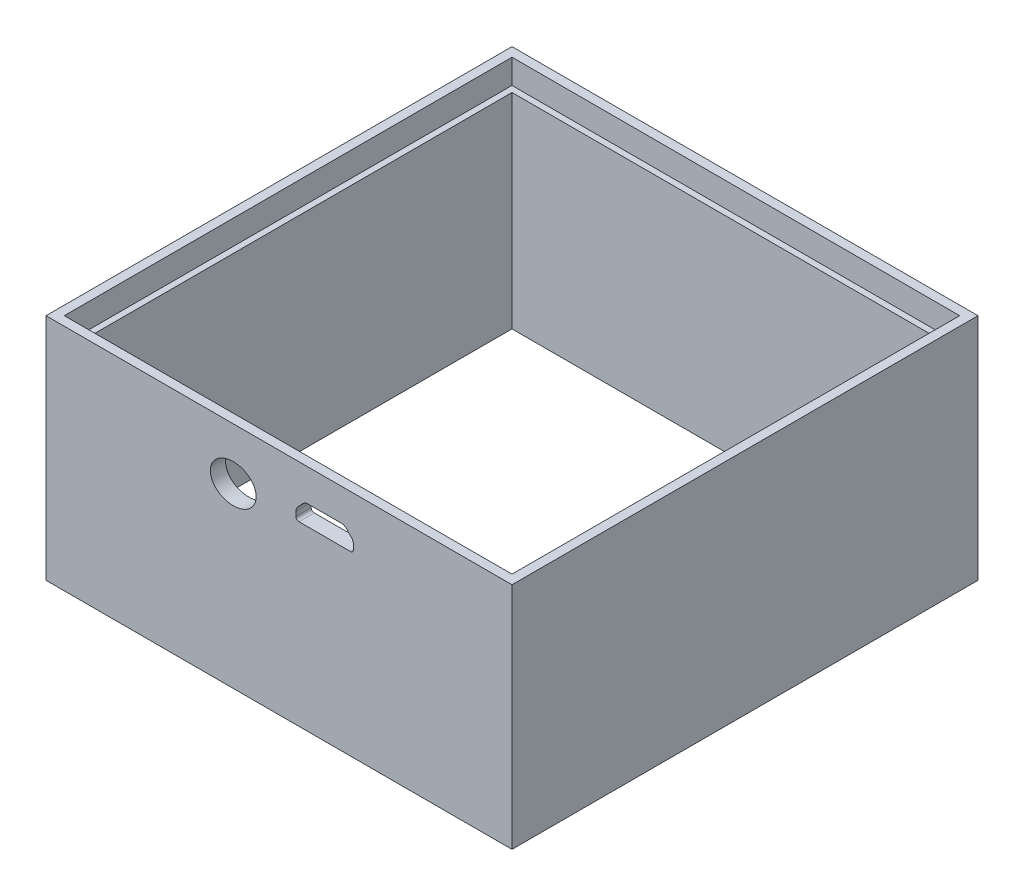
ISO-10303-21;
HEADER;
FILE_DESCRIPTION(('STEP AP214'),'2;1');
FILE_NAME('part.step','',(''),(''),'','','');
FILE_SCHEMA(('AUTOMOTIVE_DESIGN { 1 0 10303 214 1 1 1 1 }'));
ENDSEC;
DATA;
#1=APPLICATION_CONTEXT('core data for automotive mechanical design processes');
#2=APPLICATION_PROTOCOL_DEFINITION('international standard','automotive_design',2000,#1);
#3=PRODUCT_CONTEXT('',#1,'mechanical');
#4=PRODUCT('Part','Part','',(#3));
#5=PRODUCT_RELATED_PRODUCT_CATEGORY('part','',(#4));
#6=PRODUCT_DEFINITION_FORMATION('','',#4);
#7=PRODUCT_DEFINITION_CONTEXT('part definition',#1,'design');
#8=PRODUCT_DEFINITION('design','',#6,#7);
#9=PRODUCT_DEFINITION_SHAPE('','',#8);
#10=(LENGTH_UNIT() NAMED_UNIT(*) SI_UNIT(.MILLI.,.METRE.));
#11=(NAMED_UNIT(*) PLANE_ANGLE_UNIT() SI_UNIT($,.RADIAN.));
#12=(NAMED_UNIT(*) SI_UNIT($,.STERADIAN.) SOLID_ANGLE_UNIT());
#13=UNCERTAINTY_MEASURE_WITH_UNIT(LENGTH_MEASURE(1.E-05),#10,'distance_accuracy_value','');
#14=(GEOMETRIC_REPRESENTATION_CONTEXT(3) GLOBAL_UNCERTAINTY_ASSIGNED_CONTEXT((#13)) GLOBAL_UNIT_ASSIGNED_CONTEXT((#10,
#11,#12)) REPRESENTATION_CONTEXT('',''));
#15=CARTESIAN_POINT('',(0.,0.,0.));
#16=DIRECTION('',(0.,0.,1.));
#17=DIRECTION('',(1.,0.,0.));
#18=AXIS2_PLACEMENT_3D('',#15,#16,#17);
#19=CARTESIAN_POINT('',(-28.5,30.,0.));
#20=DIRECTION('',(0.,0.,-1.));
#21=DIRECTION('',(-1.,0.,0.));
#22=AXIS2_PLACEMENT_3D('',#19,#20,#21);
#23=PLANE('',#22);
#24=CARTESIAN_POINT('',(-5.99255578575196,23.2153393240226,0.));
#25=DIRECTION('',(0.,0.,-1.));
#26=DIRECTION('',(1.,0.,0.));
#27=AXIS2_PLACEMENT_3D('',#24,#25,#26);
#28=ELLIPSE('',#27,3.,2.5);
#29=CARTESIAN_POINT('',(-2.99255578575196,23.2153393240226,0.));
#30=VERTEX_POINT('',#29);
#31=EDGE_CURVE('E338',#30,#30,#28,.T.);
#32=ORIENTED_EDGE('',*,*,#31,.F.);
#33=EDGE_LOOP('',(#32));
#34=FACE_BOUND('',#33,.T.);
#35=DIRECTION('',(0.,-1.,0.));
#36=VECTOR('',#35,1.);
#37=CARTESIAN_POINT('',(-28.5,30.,0.));
#38=LINE('',#37,#36);
#39=CARTESIAN_POINT('',(-28.5,26.8,0.));
#40=VERTEX_POINT('',#39);
#41=CARTESIAN_POINT('',(-28.5,0.,0.));
#42=VERTEX_POINT('',#41);
#43=EDGE_CURVE('E469',#40,#42,#38,.T.);
#44=ORIENTED_EDGE('',*,*,#43,.F.);
#45=DIRECTION('',(1.,0.,0.));
#46=VECTOR('',#45,1.);
#47=CARTESIAN_POINT('',(-28.5,26.8,0.));
#48=LINE('',#47,#46);
#49=CARTESIAN_POINT('',(28.5,26.8,0.));
#50=VERTEX_POINT('',#49);
#51=EDGE_CURVE('E490',#40,#50,#48,.T.);
#52=ORIENTED_EDGE('',*,*,#51,.T.);
#53=DIRECTION('',(0.,-1.,0.));
#54=VECTOR('',#53,1.);
#55=CARTESIAN_POINT('',(28.5,30.,0.));
#56=LINE('',#55,#54);
#57=CARTESIAN_POINT('',(28.5,0.,0.));
#58=VERTEX_POINT('',#57);
#59=EDGE_CURVE('E453',#50,#58,#56,.T.);
#60=ORIENTED_EDGE('',*,*,#59,.T.);
#61=DIRECTION('',(1.,0.,0.));
#62=VECTOR('',#61,1.);
#63=CARTESIAN_POINT('',(-28.5,0.,0.));
#64=LINE('',#63,#62);
#65=EDGE_CURVE('E486',#42,#58,#64,.T.);
#66=ORIENTED_EDGE('',*,*,#65,.F.);
#67=EDGE_LOOP('',(#44,#52,#60,#66));
#68=FACE_BOUND('',#67,.T.);
#69=CARTESIAN_POINT('',(2.60777454000149,23.6,0.));
#70=DIRECTION('',(0.,0.,-1.));
#71=DIRECTION('',(-1.,0.,0.));
#72=AXIS2_PLACEMENT_3D('',#69,#70,#71);
#73=CIRCLE('',#72,0.399999999999942);
#74=CARTESIAN_POINT('',(2.20777454000155,23.6,0.));
#75=VERTEX_POINT('',#74);
#76=CARTESIAN_POINT('',(2.60777454000149,23.2,0.));
#77=VERTEX_POINT('',#76);
#78=EDGE_CURVE('E262',#75,#77,#73,.F.);
#79=ORIENTED_EDGE('',*,*,#78,.T.);
#80=DIRECTION('',(1.,0.,0.));
#81=VECTOR('',#80,1.);
#82=CARTESIAN_POINT('',(0.,23.2000000000001,0.));
#83=LINE('',#82,#81);
#84=CARTESIAN_POINT('',(9.35777454000155,23.2,0.));
#85=VERTEX_POINT('',#84);
#86=EDGE_CURVE('E55',#77,#85,#83,.T.);
#87=ORIENTED_EDGE('',*,*,#86,.T.);
#88=CARTESIAN_POINT('',(9.35777454000155,23.6,0.));
#89=DIRECTION('',(0.,0.,-1.));
#90=DIRECTION('',(-1.,0.,0.));
#91=AXIS2_PLACEMENT_3D('',#88,#89,#90);
#92=CIRCLE('',#91,0.39999999999994);
#93=CARTESIAN_POINT('',(9.75777454000149,23.6,0.));
#94=VERTEX_POINT('',#93);
#95=EDGE_CURVE('E223',#85,#94,#92,.F.);
#96=ORIENTED_EDGE('',*,*,#95,.T.);
#97=DIRECTION('',(0.,1.,0.));
#98=VECTOR('',#97,1.);
#99=CARTESIAN_POINT('',(9.75777454000142,0.,0.));
#100=LINE('',#99,#98);
#101=CARTESIAN_POINT('',(9.75777454000149,24.147689712403,0.));
#102=VERTEX_POINT('',#101);
#103=EDGE_CURVE('E227',#94,#102,#100,.T.);
#104=ORIENTED_EDGE('',*,*,#103,.T.);
#105=CARTESIAN_POINT('',(8.75777454000148,24.147689712403,0.));
#106=DIRECTION('',(0.,0.,-1.));
#107=DIRECTION('',(-1.,0.,0.));
#108=AXIS2_PLACEMENT_3D('',#105,#106,#107);
#109=CIRCLE('',#108,1.00000000000001);
#110=CARTESIAN_POINT('',(9.47916186103244,24.8402215405928,0.));
#111=VERTEX_POINT('',#110);
#112=EDGE_CURVE('E294',#102,#111,#109,.F.);
#113=ORIENTED_EDGE('',*,*,#112,.T.);
#114=DIRECTION('',(-0.692531828189709,0.721387321030956,0.));
#115=VECTOR('',#114,1.);
#116=CARTESIAN_POINT('',(17.3427219712748,16.6490130924236,0.));
#117=LINE('',#116,#115);
#118=CARTESIAN_POINT('',(8.85294398493937,25.4925318281897,0.));
#119=VERTEX_POINT('',#118);
#120=EDGE_CURVE('E290',#111,#119,#117,.T.);
#121=ORIENTED_EDGE('',*,*,#120,.T.);
#122=CARTESIAN_POINT('',(8.13155666390841,24.8,0.));
#123=DIRECTION('',(0.,0.,-1.));
#124=DIRECTION('',(-1.,0.,0.));
#125=AXIS2_PLACEMENT_3D('',#122,#123,#124);
#126=CIRCLE('',#125,1.00000000000001);
#127=CARTESIAN_POINT('',(8.13155666390841,25.8,0.));
#128=VERTEX_POINT('',#127);
#129=EDGE_CURVE('E286',#119,#128,#126,.F.);
#130=ORIENTED_EDGE('',*,*,#129,.T.);
#131=DIRECTION('',(-1.,0.,0.));
#132=VECTOR('',#131,1.);
#133=CARTESIAN_POINT('',(0.,25.8,0.));
#134=LINE('',#133,#132);
#135=CARTESIAN_POINT('',(3.83399241609457,25.8,0.));
#136=VERTEX_POINT('',#135);
#137=EDGE_CURVE('E282',#128,#136,#134,.T.);
#138=ORIENTED_EDGE('',*,*,#137,.T.);
#139=CARTESIAN_POINT('',(3.83399241609457,24.8,0.));
#140=DIRECTION('',(0.,0.,-1.));
#141=DIRECTION('',(-1.,0.,0.));
#142=AXIS2_PLACEMENT_3D('',#139,#140,#141);
#143=CIRCLE('',#142,1.00000000000002);
#144=CARTESIAN_POINT('',(3.11260509506368,25.4925318281898,0.));
#145=VERTEX_POINT('',#144);
#146=EDGE_CURVE('E278',#145,#136,#143,.T.);
#147=ORIENTED_EDGE('',*,*,#146,.F.);
#148=DIRECTION('',(0.692531828189797,0.721387321030872,0.));
#149=VECTOR('',#148,1.);
#150=CARTESIAN_POINT('',(-11.115854215237,10.67122004663,0.));
#151=LINE('',#150,#149);
#152=CARTESIAN_POINT('',(2.48638721897064,24.840221540593,0.));
#153=VERTEX_POINT('',#152);
#154=EDGE_CURVE('E274',#153,#145,#151,.T.);
#155=ORIENTED_EDGE('',*,*,#154,.F.);
#156=CARTESIAN_POINT('',(3.20777454000152,24.1476897124032,0.));
#157=DIRECTION('',(0.,0.,-1.));
#158=DIRECTION('',(-1.,0.,0.));
#159=AXIS2_PLACEMENT_3D('',#156,#157,#158);
#160=CIRCLE('',#159,1.00000000000001);
#161=CARTESIAN_POINT('',(2.20777454000151,24.1476897124032,0.));
#162=VERTEX_POINT('',#161);
#163=EDGE_CURVE('E270',#153,#162,#160,.F.);
#164=ORIENTED_EDGE('',*,*,#163,.T.);
#165=DIRECTION('',(0.,1.,0.));
#166=VECTOR('',#165,1.);
#167=CARTESIAN_POINT('',(2.2077745400033,1.64330529824927E-13,0.));
#168=LINE('',#167,#166);
#169=EDGE_CURVE('E266',#75,#162,#168,.T.);
#170=ORIENTED_EDGE('',*,*,#169,.F.);
#171=EDGE_LOOP('',(#79,#87,#96,#104,#113,#121,#130,#138,#147,#155,#164,#170));
#172=FACE_BOUND('',#171,.T.);
#173=ADVANCED_FACE('F39',(#34,#68,#172),#23,.T.);
#174=CARTESIAN_POINT('',(30.5,30.,2.));
#175=DIRECTION('',(0.,0.,-1.));
#176=DIRECTION('',(-1.,0.,0.));
#177=AXIS2_PLACEMENT_3D('',#174,#175,#176);
#178=PLANE('',#177);
#179=DIRECTION('',(1.,0.,0.));
#180=VECTOR('',#179,1.);
#181=CARTESIAN_POINT('',(30.5,0.,2.));
#182=LINE('',#181,#180);
#183=CARTESIAN_POINT('',(-30.5,0.,2.00000000000001));
#184=VERTEX_POINT('',#183);
#185=CARTESIAN_POINT('',(30.5,0.,2.));
#186=VERTEX_POINT('',#185);
#187=EDGE_CURVE('E425',#184,#186,#182,.T.);
#188=ORIENTED_EDGE('',*,*,#187,.T.);
#189=DIRECTION('',(0.,-1.,0.));
#190=VECTOR('',#189,1.);
#191=CARTESIAN_POINT('',(30.5,30.,2.));
#192=LINE('',#191,#190);
#193=CARTESIAN_POINT('',(30.5,30.,2.));
#194=VERTEX_POINT('',#193);
#195=EDGE_CURVE('E433',#194,#186,#192,.T.);
#196=ORIENTED_EDGE('',*,*,#195,.F.);
#197=DIRECTION('',(1.,0.,0.));
#198=VECTOR('',#197,1.);
#199=CARTESIAN_POINT('',(30.5,30.,2.));
#200=LINE('',#199,#198);
#201=CARTESIAN_POINT('',(-30.5,30.,2.00000000000001));
#202=VERTEX_POINT('',#201);
#203=EDGE_CURVE('E437',#202,#194,#200,.T.);
#204=ORIENTED_EDGE('',*,*,#203,.F.);
#205=DIRECTION('',(0.,-1.,0.));
#206=VECTOR('',#205,1.);
#207=CARTESIAN_POINT('',(-30.5,30.,2.00000000000001));
#208=LINE('',#207,#206);
#209=EDGE_CURVE('E421',#202,#184,#208,.T.);
#210=ORIENTED_EDGE('',*,*,#209,.T.);
#211=EDGE_LOOP('',(#188,#196,#204,#210));
#212=FACE_BOUND('',#211,.T.);
#213=CARTESIAN_POINT('',(-5.99255578575196,23.2153393240226,2.00000000000001));
#214=DIRECTION('',(0.,0.,-1.));
#215=DIRECTION('',(1.,0.,0.));
#216=AXIS2_PLACEMENT_3D('',#213,#214,#215);
#217=ELLIPSE('',#216,3.,2.5);
#218=CARTESIAN_POINT('',(-2.99255578575196,23.2153393240226,2.00000000000001));
#219=VERTEX_POINT('',#218);
#220=EDGE_CURVE('E263',#219,#219,#217,.T.);
#221=ORIENTED_EDGE('',*,*,#220,.T.);
#222=EDGE_LOOP('',(#221));
#223=FACE_BOUND('',#222,.T.);
#224=DIRECTION('',(1.,0.,0.));
#225=VECTOR('',#224,1.);
#226=CARTESIAN_POINT('',(0.,23.2000000000001,2.00000000000001));
#227=LINE('',#226,#225);
#228=CARTESIAN_POINT('',(2.60777454000149,23.2,2.00000000000001));
#229=VERTEX_POINT('',#228);
#230=CARTESIAN_POINT('',(9.35777454000155,23.2,2.00000000000001));
#231=VERTEX_POINT('',#230);
#232=EDGE_CURVE('E212',#229,#231,#227,.T.);
#233=ORIENTED_EDGE('',*,*,#232,.F.);
#234=CARTESIAN_POINT('',(2.60777454000149,23.6,2.00000000000001));
#235=DIRECTION('',(0.,0.,-1.));
#236=DIRECTION('',(-1.,0.,0.));
#237=AXIS2_PLACEMENT_3D('',#234,#235,#236);
#238=CIRCLE('',#237,0.399999999999942);
#239=CARTESIAN_POINT('',(2.20777454000155,23.6,2.00000000000001));
#240=VERTEX_POINT('',#239);
#241=EDGE_CURVE('E203',#240,#229,#238,.F.);
#242=ORIENTED_EDGE('',*,*,#241,.F.);
#243=DIRECTION('',(0.,1.,0.));
#244=VECTOR('',#243,1.);
#245=CARTESIAN_POINT('',(2.2077745400033,1.64330529824927E-13,2.00000000000001));
#246=LINE('',#245,#244);
#247=CARTESIAN_POINT('',(2.20777454000151,24.1476897124032,2.00000000000001));
#248=VERTEX_POINT('',#247);
#249=EDGE_CURVE('E63',#240,#248,#246,.T.);
#250=ORIENTED_EDGE('',*,*,#249,.T.);
#251=CARTESIAN_POINT('',(3.20777454000152,24.1476897124032,2.00000000000001));
#252=DIRECTION('',(0.,0.,-1.));
#253=DIRECTION('',(-1.,0.,0.));
#254=AXIS2_PLACEMENT_3D('',#251,#252,#253);
#255=CIRCLE('',#254,1.00000000000001);
#256=CARTESIAN_POINT('',(2.48638721897064,24.840221540593,2.00000000000001));
#257=VERTEX_POINT('',#256);
#258=EDGE_CURVE('E232',#257,#248,#255,.F.);
#259=ORIENTED_EDGE('',*,*,#258,.F.);
#260=DIRECTION('',(0.692531828189797,0.721387321030872,0.));
#261=VECTOR('',#260,1.);
#262=CARTESIAN_POINT('',(-11.115854215237,10.67122004663,2.00000000000001));
#263=LINE('',#262,#261);
#264=CARTESIAN_POINT('',(3.11260509506368,25.4925318281898,2.00000000000001));
#265=VERTEX_POINT('',#264);
#266=EDGE_CURVE('E235',#257,#265,#263,.T.);
#267=ORIENTED_EDGE('',*,*,#266,.T.);
#268=CARTESIAN_POINT('',(3.83399241609457,24.8,2.00000000000001));
#269=DIRECTION('',(0.,0.,-1.));
#270=DIRECTION('',(-1.,0.,0.));
#271=AXIS2_PLACEMENT_3D('',#268,#269,#270);
#272=CIRCLE('',#271,1.00000000000002);
#273=CARTESIAN_POINT('',(3.83399241609457,25.8,2.00000000000001));
#274=VERTEX_POINT('',#273);
#275=EDGE_CURVE('E239',#265,#274,#272,.T.);
#276=ORIENTED_EDGE('',*,*,#275,.T.);
#277=DIRECTION('',(-1.,0.,0.));
#278=VECTOR('',#277,1.);
#279=CARTESIAN_POINT('',(0.,25.8,2.00000000000001));
#280=LINE('',#279,#278);
#281=CARTESIAN_POINT('',(8.13155666390841,25.8,2.00000000000001));
#282=VERTEX_POINT('',#281);
#283=EDGE_CURVE('E243',#282,#274,#280,.T.);
#284=ORIENTED_EDGE('',*,*,#283,.F.);
#285=CARTESIAN_POINT('',(8.13155666390841,24.8,2.00000000000001));
#286=DIRECTION('',(0.,0.,-1.));
#287=DIRECTION('',(-1.,0.,0.));
#288=AXIS2_PLACEMENT_3D('',#285,#286,#287);
#289=CIRCLE('',#288,1.00000000000001);
#290=CARTESIAN_POINT('',(8.85294398493937,25.4925318281897,2.00000000000001));
#291=VERTEX_POINT('',#290);
#292=EDGE_CURVE('E246',#291,#282,#289,.F.);
#293=ORIENTED_EDGE('',*,*,#292,.F.);
#294=DIRECTION('',(-0.692531828189709,0.721387321030956,0.));
#295=VECTOR('',#294,1.);
#296=CARTESIAN_POINT('',(17.3427219712748,16.6490130924236,2.00000000000001));
#297=LINE('',#296,#295);
#298=CARTESIAN_POINT('',(9.47916186103244,24.8402215405928,2.00000000000001));
#299=VERTEX_POINT('',#298);
#300=EDGE_CURVE('E249',#299,#291,#297,.T.);
#301=ORIENTED_EDGE('',*,*,#300,.F.);
#302=CARTESIAN_POINT('',(8.75777454000148,24.147689712403,2.00000000000001));
#303=DIRECTION('',(0.,0.,-1.));
#304=DIRECTION('',(-1.,0.,0.));
#305=AXIS2_PLACEMENT_3D('',#302,#303,#304);
#306=CIRCLE('',#305,1.00000000000001);
#307=CARTESIAN_POINT('',(9.75777454000149,24.147689712403,2.00000000000001));
#308=VERTEX_POINT('',#307);
#309=EDGE_CURVE('E252',#308,#299,#306,.F.);
#310=ORIENTED_EDGE('',*,*,#309,.F.);
#311=DIRECTION('',(0.,1.,0.));
#312=VECTOR('',#311,1.);
#313=CARTESIAN_POINT('',(9.75777454000142,0.,2.00000000000001));
#314=LINE('',#313,#312);
#315=CARTESIAN_POINT('',(9.75777454000149,23.6,2.00000000000001));
#316=VERTEX_POINT('',#315);
#317=EDGE_CURVE('E255',#316,#308,#314,.T.);
#318=ORIENTED_EDGE('',*,*,#317,.F.);
#319=CARTESIAN_POINT('',(9.35777454000155,23.6,2.00000000000001));
#320=DIRECTION('',(0.,0.,-1.));
#321=DIRECTION('',(-1.,0.,0.));
#322=AXIS2_PLACEMENT_3D('',#319,#320,#321);
#323=CIRCLE('',#322,0.39999999999994);
#324=EDGE_CURVE('E217',#231,#316,#323,.F.);
#325=ORIENTED_EDGE('',*,*,#324,.F.);
#326=EDGE_LOOP('',(#233,#242,#250,#259,#267,#276,#284,#293,#301,#310,#318,#325));
#327=FACE_BOUND('',#326,.T.);
#328=ADVANCED_FACE('F220',(#212,#223,#327),#178,.F.);
#329=CARTESIAN_POINT('',(28.5,30.,0.));
#330=DIRECTION('',(-1.,0.,0.));
#331=DIRECTION('',(0.,0.,1.));
#332=AXIS2_PLACEMENT_3D('',#329,#330,#331);
#333=PLANE('',#332);
#334=ORIENTED_EDGE('',*,*,#59,.F.);
#335=DIRECTION('',(0.,0.,-1.));
#336=VECTOR('',#335,1.);
#337=CARTESIAN_POINT('',(28.5,26.8,0.));
#338=LINE('',#337,#336);
#339=CARTESIAN_POINT('',(28.5,26.8,-57.));
#340=VERTEX_POINT('',#339);
#341=EDGE_CURVE('E493',#50,#340,#338,.T.);
#342=ORIENTED_EDGE('',*,*,#341,.T.);
#343=DIRECTION('',(0.,-1.,0.));
#344=VECTOR('',#343,1.);
#345=CARTESIAN_POINT('',(28.5,30.,-57.));
#346=LINE('',#345,#344);
#347=CARTESIAN_POINT('',(28.5,0.,-57.));
#348=VERTEX_POINT('',#347);
#349=EDGE_CURVE('E457',#340,#348,#346,.T.);
#350=ORIENTED_EDGE('',*,*,#349,.T.);
#351=DIRECTION('',(0.,0.,-1.));
#352=VECTOR('',#351,1.);
#353=CARTESIAN_POINT('',(28.5,0.,0.));
#354=LINE('',#353,#352);
#355=EDGE_CURVE('E482',#58,#348,#354,.T.);
#356=ORIENTED_EDGE('',*,*,#355,.F.);
#357=EDGE_LOOP('',(#334,#342,#350,#356));
#358=FACE_BOUND('',#357,.T.);
#359=ADVANCED_FACE('F376',(#358),#333,.T.);
#360=CARTESIAN_POINT('',(28.5,30.,-57.));
#361=DIRECTION('',(0.,0.,1.));
#362=DIRECTION('',(1.,0.,0.));
#363=AXIS2_PLACEMENT_3D('',#360,#361,#362);
#364=PLANE('',#363);
#365=ORIENTED_EDGE('',*,*,#349,.F.);
#366=DIRECTION('',(-1.,0.,0.));
#367=VECTOR('',#366,1.);
#368=CARTESIAN_POINT('',(28.5,26.8,-57.));
#369=LINE('',#368,#367);
#370=CARTESIAN_POINT('',(-28.5,26.8,-57.));
#371=VERTEX_POINT('',#370);
#372=EDGE_CURVE('E496',#340,#371,#369,.T.);
#373=ORIENTED_EDGE('',*,*,#372,.T.);
#374=DIRECTION('',(0.,-1.,0.));
#375=VECTOR('',#374,1.);
#376=CARTESIAN_POINT('',(-28.5,30.,-57.));
#377=LINE('',#376,#375);
#378=CARTESIAN_POINT('',(-28.5,0.,-57.));
#379=VERTEX_POINT('',#378);
#380=EDGE_CURVE('E464',#371,#379,#377,.T.);
#381=ORIENTED_EDGE('',*,*,#380,.T.);
#382=DIRECTION('',(-1.,0.,0.));
#383=VECTOR('',#382,1.);
#384=CARTESIAN_POINT('',(28.5,0.,-57.));
#385=LINE('',#384,#383);
#386=EDGE_CURVE('E478',#348,#379,#385,.T.);
#387=ORIENTED_EDGE('',*,*,#386,.F.);
#388=EDGE_LOOP('',(#365,#373,#381,#387));
#389=FACE_BOUND('',#388,.T.);
#390=ADVANCED_FACE('F372',(#389),#364,.T.);
#391=CARTESIAN_POINT('',(-28.5,30.,-57.));
#392=DIRECTION('',(1.,0.,0.));
#393=DIRECTION('',(0.,0.,-1.));
#394=AXIS2_PLACEMENT_3D('',#391,#392,#393);
#395=PLANE('',#394);
#396=ORIENTED_EDGE('',*,*,#380,.F.);
#397=DIRECTION('',(0.,0.,1.));
#398=VECTOR('',#397,1.);
#399=CARTESIAN_POINT('',(-28.5,26.8,-57.));
#400=LINE('',#399,#398);
#401=EDGE_CURVE('E11',#371,#40,#400,.T.);
#402=ORIENTED_EDGE('',*,*,#401,.T.);
#403=ORIENTED_EDGE('',*,*,#43,.T.);
#404=DIRECTION('',(0.,0.,1.));
#405=VECTOR('',#404,1.);
#406=CARTESIAN_POINT('',(-28.5,0.,-57.));
#407=LINE('',#406,#405);
#408=EDGE_CURVE('E474',#379,#42,#407,.T.);
#409=ORIENTED_EDGE('',*,*,#408,.F.);
#410=EDGE_LOOP('',(#396,#402,#403,#409));
#411=FACE_BOUND('',#410,.T.);
#412=ADVANCED_FACE('F368',(#411),#395,.T.);
#413=CARTESIAN_POINT('',(0.,30.,0.));
#414=DIRECTION('',(0.,-1.,0.));
#415=DIRECTION('',(0.,0.,-1.));
#416=AXIS2_PLACEMENT_3D('',#413,#414,#415);
#417=PLANE('',#416);
#418=DIRECTION('',(0.,0.,1.));
#419=VECTOR('',#418,1.);
#420=CARTESIAN_POINT('',(-29.3,30.,-57.8));
#421=LINE('',#420,#419);
#422=CARTESIAN_POINT('',(-29.3,30.,-57.8));
#423=VERTEX_POINT('',#422);
#424=CARTESIAN_POINT('',(-29.3,30.,0.8));
#425=VERTEX_POINT('',#424);
#426=EDGE_CURVE('E523',#423,#425,#421,.T.);
#427=ORIENTED_EDGE('',*,*,#426,.F.);
#428=DIRECTION('',(-1.,0.,0.));
#429=VECTOR('',#428,1.);
#430=CARTESIAN_POINT('',(29.3,30.,-57.8));
#431=LINE('',#430,#429);
#432=CARTESIAN_POINT('',(29.3,30.,-57.8));
#433=VERTEX_POINT('',#432);
#434=EDGE_CURVE('E304',#433,#423,#431,.T.);
#435=ORIENTED_EDGE('',*,*,#434,.F.);
#436=DIRECTION('',(0.,0.,-1.));
#437=VECTOR('',#436,1.);
#438=CARTESIAN_POINT('',(29.3,30.,0.8));
#439=LINE('',#438,#437);
#440=CARTESIAN_POINT('',(29.3,30.,0.8));
#441=VERTEX_POINT('',#440);
#442=EDGE_CURVE('E514',#441,#433,#439,.T.);
#443=ORIENTED_EDGE('',*,*,#442,.F.);
#444=DIRECTION('',(1.,0.,0.));
#445=VECTOR('',#444,1.);
#446=CARTESIAN_POINT('',(-29.3,30.,0.8));
#447=LINE('',#446,#445);
#448=EDGE_CURVE('E519',#425,#441,#447,.T.);
#449=ORIENTED_EDGE('',*,*,#448,.F.);
#450=EDGE_LOOP('',(#427,#435,#443,#449));
#451=FACE_BOUND('',#450,.T.);
#452=DIRECTION('',(0.,0.,-1.));
#453=VECTOR('',#452,1.);
#454=CARTESIAN_POINT('',(30.5,30.,-59.));
#455=LINE('',#454,#453);
#456=CARTESIAN_POINT('',(30.5,30.,-59.));
#457=VERTEX_POINT('',#456);
#458=EDGE_CURVE('E429',#194,#457,#455,.T.);
#459=ORIENTED_EDGE('',*,*,#458,.T.);
#460=DIRECTION('',(-1.,0.,0.));
#461=VECTOR('',#460,1.);
#462=CARTESIAN_POINT('',(-30.5,30.,-59.));
#463=LINE('',#462,#461);
#464=CARTESIAN_POINT('',(-30.5,30.,-59.));
#465=VERTEX_POINT('',#464);
#466=EDGE_CURVE('E444',#457,#465,#463,.T.);
#467=ORIENTED_EDGE('',*,*,#466,.T.);
#468=DIRECTION('',(0.,0.,1.));
#469=VECTOR('',#468,1.);
#470=CARTESIAN_POINT('',(-30.5,30.,2.00000000000001));
#471=LINE('',#470,#469);
#472=EDGE_CURVE('E419',#465,#202,#471,.T.);
#473=ORIENTED_EDGE('',*,*,#472,.T.);
#474=ORIENTED_EDGE('',*,*,#203,.T.);
#475=EDGE_LOOP('',(#459,#467,#473,#474));
#476=FACE_BOUND('',#475,.T.);
#477=ADVANCED_FACE('F371',(#451,#476),#417,.F.);
#478=CARTESIAN_POINT('',(0.,0.,0.));
#479=DIRECTION('',(0.,-1.,0.));
#480=DIRECTION('',(0.,0.,-1.));
#481=AXIS2_PLACEMENT_3D('',#478,#479,#480);
#482=PLANE('',#481);
#483=DIRECTION('',(0.,0.,-1.));
#484=VECTOR('',#483,1.);
#485=CARTESIAN_POINT('',(30.5,0.,-59.));
#486=LINE('',#485,#484);
#487=CARTESIAN_POINT('',(30.5,0.,-59.));
#488=VERTEX_POINT('',#487);
#489=EDGE_CURVE('E415',#186,#488,#486,.T.);
#490=ORIENTED_EDGE('',*,*,#489,.F.);
#491=ORIENTED_EDGE('',*,*,#187,.F.);
#492=DIRECTION('',(0.,0.,1.));
#493=VECTOR('',#492,1.);
#494=CARTESIAN_POINT('',(-30.5,0.,2.00000000000001));
#495=LINE('',#494,#493);
#496=CARTESIAN_POINT('',(-30.5,0.,-59.));
#497=VERTEX_POINT('',#496);
#498=EDGE_CURVE('E414',#497,#184,#495,.T.);
#499=ORIENTED_EDGE('',*,*,#498,.F.);
#500=DIRECTION('',(-1.,0.,0.));
#501=VECTOR('',#500,1.);
#502=CARTESIAN_POINT('',(-30.5,0.,-59.));
#503=LINE('',#502,#501);
#504=EDGE_CURVE('E405',#488,#497,#503,.T.);
#505=ORIENTED_EDGE('',*,*,#504,.F.);
#506=EDGE_LOOP('',(#490,#491,#499,#505));
#507=FACE_BOUND('',#506,.T.);
#508=ORIENTED_EDGE('',*,*,#408,.T.);
#509=ORIENTED_EDGE('',*,*,#65,.T.);
#510=ORIENTED_EDGE('',*,*,#355,.T.);
#511=ORIENTED_EDGE('',*,*,#386,.T.);
#512=EDGE_LOOP('',(#508,#509,#510,#511));
#513=FACE_BOUND('',#512,.T.);
#514=ADVANCED_FACE('F386',(#507,#513),#482,.T.);
#515=CARTESIAN_POINT('',(30.5,30.,-59.));
#516=DIRECTION('',(-1.,0.,0.));
#517=DIRECTION('',(0.,0.,1.));
#518=AXIS2_PLACEMENT_3D('',#515,#516,#517);
#519=PLANE('',#518);
#520=ORIENTED_EDGE('',*,*,#489,.T.);
#521=DIRECTION('',(0.,-1.,0.));
#522=VECTOR('',#521,1.);
#523=CARTESIAN_POINT('',(30.5,30.,-59.));
#524=LINE('',#523,#522);
#525=EDGE_CURVE('E48',#457,#488,#524,.T.);
#526=ORIENTED_EDGE('',*,*,#525,.F.);
#527=ORIENTED_EDGE('',*,*,#458,.F.);
#528=ORIENTED_EDGE('',*,*,#195,.T.);
#529=EDGE_LOOP('',(#520,#526,#527,#528));
#530=FACE_BOUND('',#529,.T.);
#531=ADVANCED_FACE('F41',(#530),#519,.F.);
#532=CARTESIAN_POINT('',(-30.5,30.,-59.));
#533=DIRECTION('',(0.,0.,1.));
#534=DIRECTION('',(1.,0.,0.));
#535=AXIS2_PLACEMENT_3D('',#532,#533,#534);
#536=PLANE('',#535);
#537=ORIENTED_EDGE('',*,*,#504,.T.);
#538=DIRECTION('',(0.,-1.,0.));
#539=VECTOR('',#538,1.);
#540=CARTESIAN_POINT('',(-30.5,30.,-59.));
#541=LINE('',#540,#539);
#542=EDGE_CURVE('E407',#465,#497,#541,.T.);
#543=ORIENTED_EDGE('',*,*,#542,.F.);
#544=ORIENTED_EDGE('',*,*,#466,.F.);
#545=ORIENTED_EDGE('',*,*,#525,.T.);
#546=EDGE_LOOP('',(#537,#543,#544,#545));
#547=FACE_BOUND('',#546,.T.);
#548=ADVANCED_FACE('F395',(#547),#536,.F.);
#549=CARTESIAN_POINT('',(-30.5,30.,2.00000000000001));
#550=DIRECTION('',(1.,0.,0.));
#551=DIRECTION('',(0.,0.,-1.));
#552=AXIS2_PLACEMENT_3D('',#549,#550,#551);
#553=PLANE('',#552);
#554=ORIENTED_EDGE('',*,*,#498,.T.);
#555=ORIENTED_EDGE('',*,*,#209,.F.);
#556=ORIENTED_EDGE('',*,*,#472,.F.);
#557=ORIENTED_EDGE('',*,*,#542,.T.);
#558=EDGE_LOOP('',(#554,#555,#556,#557));
#559=FACE_BOUND('',#558,.T.);
#560=ADVANCED_FACE('F366',(#559),#553,.F.);
#561=CARTESIAN_POINT('',(29.3,26.8,-57.8));
#562=DIRECTION('',(0.,0.,-1.));
#563=DIRECTION('',(-1.,0.,0.));
#564=AXIS2_PLACEMENT_3D('',#561,#562,#563);
#565=PLANE('',#564);
#566=ORIENTED_EDGE('',*,*,#434,.T.);
#567=DIRECTION('',(0.,1.,0.));
#568=VECTOR('',#567,1.);
#569=CARTESIAN_POINT('',(-29.3,26.8,-57.8));
#570=LINE('',#569,#568);
#571=CARTESIAN_POINT('',(-29.3,26.8,-57.8));
#572=VERTEX_POINT('',#571);
#573=EDGE_CURVE('E501',#572,#423,#570,.T.);
#574=ORIENTED_EDGE('',*,*,#573,.F.);
#575=DIRECTION('',(-1.,0.,0.));
#576=VECTOR('',#575,1.);
#577=CARTESIAN_POINT('',(29.3,26.8,-57.8));
#578=LINE('',#577,#576);
#579=CARTESIAN_POINT('',(29.3,26.8,-57.8));
#580=VERTEX_POINT('',#579);
#581=EDGE_CURVE('E518',#580,#572,#578,.T.);
#582=ORIENTED_EDGE('',*,*,#581,.F.);
#583=DIRECTION('',(0.,1.,0.));
#584=VECTOR('',#583,1.);
#585=CARTESIAN_POINT('',(29.3,26.8,-57.8));
#586=LINE('',#585,#584);
#587=EDGE_CURVE('E500',#580,#433,#586,.T.);
#588=ORIENTED_EDGE('',*,*,#587,.T.);
#589=EDGE_LOOP('',(#566,#574,#582,#588));
#590=FACE_BOUND('',#589,.T.);
#591=ADVANCED_FACE('F356',(#590),#565,.F.);
#592=CARTESIAN_POINT('',(29.3,26.8,0.8));
#593=DIRECTION('',(1.,0.,0.));
#594=DIRECTION('',(0.,0.,-1.));
#595=AXIS2_PLACEMENT_3D('',#592,#593,#594);
#596=PLANE('',#595);
#597=ORIENTED_EDGE('',*,*,#442,.T.);
#598=ORIENTED_EDGE('',*,*,#587,.F.);
#599=DIRECTION('',(0.,0.,-1.));
#600=VECTOR('',#599,1.);
#601=CARTESIAN_POINT('',(29.3,26.8,0.8));
#602=LINE('',#601,#600);
#603=CARTESIAN_POINT('',(29.3,26.8,0.8));
#604=VERTEX_POINT('',#603);
#605=EDGE_CURVE('E506',#604,#580,#602,.T.);
#606=ORIENTED_EDGE('',*,*,#605,.F.);
#607=DIRECTION('',(0.,1.,0.));
#608=VECTOR('',#607,1.);
#609=CARTESIAN_POINT('',(29.3,26.8,0.8));
#610=LINE('',#609,#608);
#611=EDGE_CURVE('E509',#604,#441,#610,.T.);
#612=ORIENTED_EDGE('',*,*,#611,.T.);
#613=EDGE_LOOP('',(#597,#598,#606,#612));
#614=FACE_BOUND('',#613,.T.);
#615=ADVANCED_FACE('F352',(#614),#596,.F.);
#616=CARTESIAN_POINT('',(-29.3,26.8,0.8));
#617=DIRECTION('',(0.,0.,1.));
#618=DIRECTION('',(1.,0.,0.));
#619=AXIS2_PLACEMENT_3D('',#616,#617,#618);
#620=PLANE('',#619);
#621=ORIENTED_EDGE('',*,*,#448,.T.);
#622=ORIENTED_EDGE('',*,*,#611,.F.);
#623=DIRECTION('',(1.,0.,0.));
#624=VECTOR('',#623,1.);
#625=CARTESIAN_POINT('',(-29.3,26.8,0.8));
#626=LINE('',#625,#624);
#627=CARTESIAN_POINT('',(-29.3,26.8,0.8));
#628=VERTEX_POINT('',#627);
#629=EDGE_CURVE('E532',#628,#604,#626,.T.);
#630=ORIENTED_EDGE('',*,*,#629,.F.);
#631=DIRECTION('',(0.,1.,0.));
#632=VECTOR('',#631,1.);
#633=CARTESIAN_POINT('',(-29.3,26.8,0.8));
#634=LINE('',#633,#632);
#635=EDGE_CURVE('E505',#628,#425,#634,.T.);
#636=ORIENTED_EDGE('',*,*,#635,.T.);
#637=EDGE_LOOP('',(#621,#622,#630,#636));
#638=FACE_BOUND('',#637,.T.);
#639=ADVANCED_FACE('F355',(#638),#620,.F.);
#640=CARTESIAN_POINT('',(-29.3,26.8,-57.8));
#641=DIRECTION('',(-1.,0.,0.));
#642=DIRECTION('',(0.,0.,1.));
#643=AXIS2_PLACEMENT_3D('',#640,#641,#642);
#644=PLANE('',#643);
#645=ORIENTED_EDGE('',*,*,#426,.T.);
#646=ORIENTED_EDGE('',*,*,#635,.F.);
#647=DIRECTION('',(0.,0.,1.));
#648=VECTOR('',#647,1.);
#649=CARTESIAN_POINT('',(-29.3,26.8,-57.8));
#650=LINE('',#649,#648);
#651=EDGE_CURVE('E536',#572,#628,#650,.T.);
#652=ORIENTED_EDGE('',*,*,#651,.F.);
#653=ORIENTED_EDGE('',*,*,#573,.T.);
#654=EDGE_LOOP('',(#645,#646,#652,#653));
#655=FACE_BOUND('',#654,.T.);
#656=ADVANCED_FACE('F350',(#655),#644,.F.);
#657=CARTESIAN_POINT('',(0.,26.8,0.));
#658=DIRECTION('',(0.,1.,0.));
#659=DIRECTION('',(0.,0.,1.));
#660=AXIS2_PLACEMENT_3D('',#657,#658,#659);
#661=PLANE('',#660);
#662=ORIENTED_EDGE('',*,*,#401,.F.);
#663=ORIENTED_EDGE('',*,*,#372,.F.);
#664=ORIENTED_EDGE('',*,*,#341,.F.);
#665=ORIENTED_EDGE('',*,*,#51,.F.);
#666=EDGE_LOOP('',(#662,#663,#664,#665));
#667=FACE_BOUND('',#666,.T.);
#668=ORIENTED_EDGE('',*,*,#581,.T.);
#669=ORIENTED_EDGE('',*,*,#651,.T.);
#670=ORIENTED_EDGE('',*,*,#629,.T.);
#671=ORIENTED_EDGE('',*,*,#605,.T.);
#672=EDGE_LOOP('',(#668,#669,#670,#671));
#673=FACE_BOUND('',#672,.T.);
#674=ADVANCED_FACE('F345',(#667,#673),#661,.T.);
#675=DIRECTION('',(0.,0.,-1.));
#676=VECTOR('',#675,1.);
#677=SURFACE_OF_LINEAR_EXTRUSION('',#217,#676);
#678=ORIENTED_EDGE('',*,*,#220,.F.);
#679=EDGE_LOOP('',(#678));
#680=FACE_BOUND('',#679,.T.);
#681=ORIENTED_EDGE('',*,*,#31,.T.);
#682=EDGE_LOOP('',(#681));
#683=FACE_BOUND('',#682,.T.);
#684=ADVANCED_FACE('F341',(#680,#683),#677,.F.);
#685=CARTESIAN_POINT('',(0.,23.2000000000001,2.00000000000001));
#686=DIRECTION('',(0.,1.,0.));
#687=DIRECTION('',(-1.,0.,0.));
#688=AXIS2_PLACEMENT_3D('',#685,#686,#687);
#689=PLANE('',#688);
#690=ORIENTED_EDGE('',*,*,#86,.F.);
#691=DIRECTION('',(0.,0.,-1.));
#692=VECTOR('',#691,1.);
#693=CARTESIAN_POINT('',(2.60777454000149,23.2,2.00000000000001));
#694=LINE('',#693,#692);
#695=EDGE_CURVE('E206',#229,#77,#694,.T.);
#696=ORIENTED_EDGE('',*,*,#695,.F.);
#697=ORIENTED_EDGE('',*,*,#232,.T.);
#698=DIRECTION('',(0.,0.,-1.));
#699=VECTOR('',#698,1.);
#700=CARTESIAN_POINT('',(9.35777454000155,23.2,2.00000000000001));
#701=LINE('',#700,#699);
#702=EDGE_CURVE('E301',#231,#85,#701,.T.);
#703=ORIENTED_EDGE('',*,*,#702,.T.);
#704=EDGE_LOOP('',(#690,#696,#697,#703));
#705=FACE_BOUND('',#704,.T.);
#706=ADVANCED_FACE('F214',(#705),#689,.T.);
#707=CARTESIAN_POINT('',(9.35777454000155,23.6,2.00000000000001));
#708=DIRECTION('',(0.,0.,-1.));
#709=DIRECTION('',(-1.,0.,0.));
#710=AXIS2_PLACEMENT_3D('',#707,#708,#709);
#711=CYLINDRICAL_SURFACE('',#710,0.39999999999994);
#712=ORIENTED_EDGE('',*,*,#95,.F.);
#713=ORIENTED_EDGE('',*,*,#702,.F.);
#714=ORIENTED_EDGE('',*,*,#324,.T.);
#715=DIRECTION('',(0.,0.,-1.));
#716=VECTOR('',#715,1.);
#717=CARTESIAN_POINT('',(9.75777454000149,23.6,2.00000000000001));
#718=LINE('',#717,#716);
#719=EDGE_CURVE('E305',#316,#94,#718,.T.);
#720=ORIENTED_EDGE('',*,*,#719,.T.);
#721=EDGE_LOOP('',(#712,#713,#714,#720));
#722=FACE_BOUND('',#721,.T.);
#723=ADVANCED_FACE('F594',(#722),#711,.F.);
#724=CARTESIAN_POINT('',(9.75777454000142,0.,2.00000000000001));
#725=DIRECTION('',(-1.,0.,0.));
#726=DIRECTION('',(0.,-1.,0.));
#727=AXIS2_PLACEMENT_3D('',#724,#725,#726);
#728=PLANE('',#727);
#729=ORIENTED_EDGE('',*,*,#103,.F.);
#730=ORIENTED_EDGE('',*,*,#719,.F.);
#731=ORIENTED_EDGE('',*,*,#317,.T.);
#732=DIRECTION('',(0.,0.,-1.));
#733=VECTOR('',#732,1.);
#734=CARTESIAN_POINT('',(9.75777454000149,24.147689712403,2.00000000000001));
#735=LINE('',#734,#733);
#736=EDGE_CURVE('E308',#308,#102,#735,.T.);
#737=ORIENTED_EDGE('',*,*,#736,.T.);
#738=EDGE_LOOP('',(#729,#730,#731,#737));
#739=FACE_BOUND('',#738,.T.);
#740=ADVANCED_FACE('F591',(#739),#728,.T.);
#741=CARTESIAN_POINT('',(8.75777454000148,24.147689712403,2.00000000000001));
#742=DIRECTION('',(0.,0.,-1.));
#743=DIRECTION('',(-1.,0.,0.));
#744=AXIS2_PLACEMENT_3D('',#741,#742,#743);
#745=CYLINDRICAL_SURFACE('',#744,1.00000000000001);
#746=ORIENTED_EDGE('',*,*,#112,.F.);
#747=ORIENTED_EDGE('',*,*,#736,.F.);
#748=ORIENTED_EDGE('',*,*,#309,.T.);
#749=DIRECTION('',(0.,0.,-1.));
#750=VECTOR('',#749,1.);
#751=CARTESIAN_POINT('',(9.47916186103244,24.8402215405928,2.00000000000001));
#752=LINE('',#751,#750);
#753=EDGE_CURVE('E311',#299,#111,#752,.T.);
#754=ORIENTED_EDGE('',*,*,#753,.T.);
#755=EDGE_LOOP('',(#746,#747,#748,#754));
#756=FACE_BOUND('',#755,.T.);
#757=ADVANCED_FACE('F588',(#756),#745,.F.);
#758=CARTESIAN_POINT('',(17.3427219712748,16.6490130924236,2.00000000000001));
#759=DIRECTION('',(-0.721387321030956,-0.692531828189709,0.));
#760=DIRECTION('',(0.692531828189709,-0.721387321030956,0.));
#761=AXIS2_PLACEMENT_3D('',#758,#759,#760);
#762=PLANE('',#761);
#763=ORIENTED_EDGE('',*,*,#120,.F.);
#764=ORIENTED_EDGE('',*,*,#753,.F.);
#765=ORIENTED_EDGE('',*,*,#300,.T.);
#766=DIRECTION('',(0.,0.,-1.));
#767=VECTOR('',#766,1.);
#768=CARTESIAN_POINT('',(8.85294398493937,25.4925318281897,2.00000000000001));
#769=LINE('',#768,#767);
#770=EDGE_CURVE('E314',#291,#119,#769,.T.);
#771=ORIENTED_EDGE('',*,*,#770,.T.);
#772=EDGE_LOOP('',(#763,#764,#765,#771));
#773=FACE_BOUND('',#772,.T.);
#774=ADVANCED_FACE('F582',(#773),#762,.T.);
#775=CARTESIAN_POINT('',(8.13155666390841,24.8,2.00000000000001));
#776=DIRECTION('',(0.,0.,-1.));
#777=DIRECTION('',(-1.,0.,0.));
#778=AXIS2_PLACEMENT_3D('',#775,#776,#777);
#779=CYLINDRICAL_SURFACE('',#778,1.00000000000001);
#780=ORIENTED_EDGE('',*,*,#129,.F.);
#781=ORIENTED_EDGE('',*,*,#770,.F.);
#782=ORIENTED_EDGE('',*,*,#292,.T.);
#783=DIRECTION('',(0.,0.,-1.));
#784=VECTOR('',#783,1.);
#785=CARTESIAN_POINT('',(8.13155666390841,25.8,2.00000000000001));
#786=LINE('',#785,#784);
#787=EDGE_CURVE('E317',#282,#128,#786,.T.);
#788=ORIENTED_EDGE('',*,*,#787,.T.);
#789=EDGE_LOOP('',(#780,#781,#782,#788));
#790=FACE_BOUND('',#789,.T.);
#791=ADVANCED_FACE('F578',(#790),#779,.F.);
#792=CARTESIAN_POINT('',(0.,25.8,2.00000000000001));
#793=DIRECTION('',(0.,-1.,0.));
#794=DIRECTION('',(1.,0.,0.));
#795=AXIS2_PLACEMENT_3D('',#792,#793,#794);
#796=PLANE('',#795);
#797=ORIENTED_EDGE('',*,*,#137,.F.);
#798=ORIENTED_EDGE('',*,*,#787,.F.);
#799=ORIENTED_EDGE('',*,*,#283,.T.);
#800=DIRECTION('',(0.,0.,-1.));
#801=VECTOR('',#800,1.);
#802=CARTESIAN_POINT('',(3.83399241609457,25.8,2.00000000000001));
#803=LINE('',#802,#801);
#804=EDGE_CURVE('E320',#274,#136,#803,.T.);
#805=ORIENTED_EDGE('',*,*,#804,.T.);
#806=EDGE_LOOP('',(#797,#798,#799,#805));
#807=FACE_BOUND('',#806,.T.);
#808=ADVANCED_FACE('F575',(#807),#796,.T.);
#809=CARTESIAN_POINT('',(3.83399241609457,24.8,2.00000000000001));
#810=DIRECTION('',(0.,0.,-1.));
#811=DIRECTION('',(-1.,0.,0.));
#812=AXIS2_PLACEMENT_3D('',#809,#810,#811);
#813=CYLINDRICAL_SURFACE('',#812,1.00000000000002);
#814=ORIENTED_EDGE('',*,*,#146,.T.);
#815=ORIENTED_EDGE('',*,*,#804,.F.);
#816=ORIENTED_EDGE('',*,*,#275,.F.);
#817=DIRECTION('',(0.,0.,-1.));
#818=VECTOR('',#817,1.);
#819=CARTESIAN_POINT('',(3.11260509506368,25.4925318281898,2.00000000000001));
#820=LINE('',#819,#818);
#821=EDGE_CURVE('E323',#265,#145,#820,.T.);
#822=ORIENTED_EDGE('',*,*,#821,.T.);
#823=EDGE_LOOP('',(#814,#815,#816,#822));
#824=FACE_BOUND('',#823,.T.);
#825=ADVANCED_FACE('F568',(#824),#813,.F.);
#826=CARTESIAN_POINT('',(-11.115854215237,10.67122004663,2.00000000000001));
#827=DIRECTION('',(-0.721387321030872,0.692531828189797,0.));
#828=DIRECTION('',(-0.692531828189797,-0.721387321030872,0.));
#829=AXIS2_PLACEMENT_3D('',#826,#827,#828);
#830=PLANE('',#829);
#831=ORIENTED_EDGE('',*,*,#154,.T.);
#832=ORIENTED_EDGE('',*,*,#821,.F.);
#833=ORIENTED_EDGE('',*,*,#266,.F.);
#834=DIRECTION('',(0.,0.,-1.));
#835=VECTOR('',#834,1.);
#836=CARTESIAN_POINT('',(2.48638721897064,24.840221540593,2.00000000000001));
#837=LINE('',#836,#835);
#838=EDGE_CURVE('E326',#257,#153,#837,.T.);
#839=ORIENTED_EDGE('',*,*,#838,.T.);
#840=EDGE_LOOP('',(#831,#832,#833,#839));
#841=FACE_BOUND('',#840,.T.);
#842=ADVANCED_FACE('F563',(#841),#830,.F.);
#843=CARTESIAN_POINT('',(3.20777454000152,24.1476897124032,2.00000000000001));
#844=DIRECTION('',(0.,0.,-1.));
#845=DIRECTION('',(-1.,0.,0.));
#846=AXIS2_PLACEMENT_3D('',#843,#844,#845);
#847=CYLINDRICAL_SURFACE('',#846,1.00000000000001);
#848=ORIENTED_EDGE('',*,*,#163,.F.);
#849=ORIENTED_EDGE('',*,*,#838,.F.);
#850=ORIENTED_EDGE('',*,*,#258,.T.);
#851=DIRECTION('',(0.,0.,-1.));
#852=VECTOR('',#851,1.);
#853=CARTESIAN_POINT('',(2.20777454000151,24.1476897124032,2.00000000000001));
#854=LINE('',#853,#852);
#855=EDGE_CURVE('E329',#248,#162,#854,.T.);
#856=ORIENTED_EDGE('',*,*,#855,.T.);
#857=EDGE_LOOP('',(#848,#849,#850,#856));
#858=FACE_BOUND('',#857,.T.);
#859=ADVANCED_FACE('F561',(#858),#847,.F.);
#860=CARTESIAN_POINT('',(2.2077745400033,1.64330529824927E-13,2.00000000000001));
#861=DIRECTION('',(-1.,0.,0.));
#862=DIRECTION('',(0.,-1.,0.));
#863=AXIS2_PLACEMENT_3D('',#860,#861,#862);
#864=PLANE('',#863);
#865=ORIENTED_EDGE('',*,*,#169,.T.);
#866=ORIENTED_EDGE('',*,*,#855,.F.);
#867=ORIENTED_EDGE('',*,*,#249,.F.);
#868=DIRECTION('',(0.,0.,-1.));
#869=VECTOR('',#868,1.);
#870=CARTESIAN_POINT('',(2.20777454000155,23.6,2.00000000000001));
#871=LINE('',#870,#869);
#872=EDGE_CURVE('E208',#240,#75,#871,.T.);
#873=ORIENTED_EDGE('',*,*,#872,.T.);
#874=EDGE_LOOP('',(#865,#866,#867,#873));
#875=FACE_BOUND('',#874,.T.);
#876=ADVANCED_FACE('F557',(#875),#864,.F.);
#877=CARTESIAN_POINT('',(2.60777454000149,23.6,2.00000000000001));
#878=DIRECTION('',(0.,0.,-1.));
#879=DIRECTION('',(-1.,0.,0.));
#880=AXIS2_PLACEMENT_3D('',#877,#878,#879);
#881=CYLINDRICAL_SURFACE('',#880,0.399999999999942);
#882=ORIENTED_EDGE('',*,*,#78,.F.);
#883=ORIENTED_EDGE('',*,*,#872,.F.);
#884=ORIENTED_EDGE('',*,*,#241,.T.);
#885=ORIENTED_EDGE('',*,*,#695,.T.);
#886=EDGE_LOOP('',(#882,#883,#884,#885));
#887=FACE_BOUND('',#886,.T.);
#888=ADVANCED_FACE('F205',(#887),#881,.F.);
#889=CLOSED_SHELL('',(#173,#328,#359,#390,#412,#477,#514,#531,#548,#560,#591,#615,#639,#656,
#674,#684,#706,#723,#740,#757,#774,#791,#808,#825,#842,#859,#876,#888));
#890=MANIFOLD_SOLID_BREP('B2',#889);
#891=ADVANCED_BREP_SHAPE_REPRESENTATION('',(#18,#890),#14);
#892=SHAPE_DEFINITION_REPRESENTATION(#9,#891);
ENDSEC;
END-ISO-10303-21;
